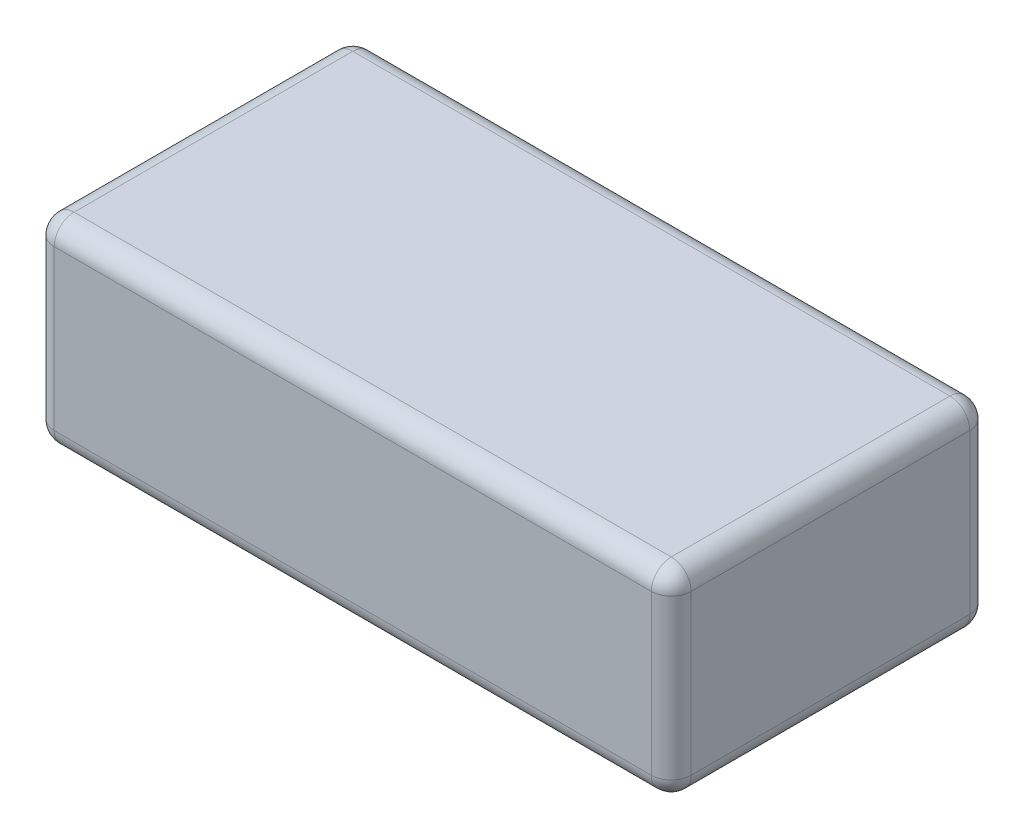
ISO-10303-21;
HEADER;
FILE_DESCRIPTION(('STEP AP214'),'2;1');
FILE_NAME('part.step','',(''),(''),'','','');
FILE_SCHEMA(('AUTOMOTIVE_DESIGN { 1 0 10303 214 1 1 1 1 }'));
ENDSEC;
DATA;
#1=APPLICATION_CONTEXT('core data for automotive mechanical design processes');
#2=APPLICATION_PROTOCOL_DEFINITION('international standard','automotive_design',2000,#1);
#3=PRODUCT_CONTEXT('',#1,'mechanical');
#4=PRODUCT('Part','Part','',(#3));
#5=PRODUCT_RELATED_PRODUCT_CATEGORY('part','',(#4));
#6=PRODUCT_DEFINITION_FORMATION('','',#4);
#7=PRODUCT_DEFINITION_CONTEXT('part definition',#1,'design');
#8=PRODUCT_DEFINITION('design','',#6,#7);
#9=PRODUCT_DEFINITION_SHAPE('','',#8);
#10=(LENGTH_UNIT() NAMED_UNIT(*) SI_UNIT(.MILLI.,.METRE.));
#11=(NAMED_UNIT(*) PLANE_ANGLE_UNIT() SI_UNIT($,.RADIAN.));
#12=(NAMED_UNIT(*) SI_UNIT($,.STERADIAN.) SOLID_ANGLE_UNIT());
#13=UNCERTAINTY_MEASURE_WITH_UNIT(LENGTH_MEASURE(1.E-05),#10,'distance_accuracy_value','');
#14=(GEOMETRIC_REPRESENTATION_CONTEXT(3) GLOBAL_UNCERTAINTY_ASSIGNED_CONTEXT((#13)) GLOBAL_UNIT_ASSIGNED_CONTEXT((#10,
#11,#12)) REPRESENTATION_CONTEXT('',''));
#15=CARTESIAN_POINT('',(0.,0.,0.));
#16=DIRECTION('',(0.,0.,1.));
#17=DIRECTION('',(1.,0.,0.));
#18=AXIS2_PLACEMENT_3D('',#15,#16,#17);
#19=CARTESIAN_POINT('',(0.75,0.05,0.35));
#20=DIRECTION('',(1.,0.,0.));
#21=DIRECTION('',(0.,0.,-1.));
#22=AXIS2_PLACEMENT_3D('',#19,#20,#21);
#23=SPHERICAL_SURFACE('',#22,0.05);
#24=CARTESIAN_POINT('',(0.75,0.05,0.35));
#25=DIRECTION('',(-1.,0.,0.));
#26=DIRECTION('',(0.,0.,1.));
#27=AXIS2_PLACEMENT_3D('',#24,#25,#26);
#28=CIRCLE('',#27,0.05);
#29=CARTESIAN_POINT('',(0.75,0.,0.35));
#30=VERTEX_POINT('',#29);
#31=CARTESIAN_POINT('',(0.75,0.050000000000024,0.4));
#32=VERTEX_POINT('',#31);
#33=EDGE_CURVE('E111',#30,#32,#28,.T.);
#34=ORIENTED_EDGE('',*,*,#33,.F.);
#35=CARTESIAN_POINT('',(0.75,0.05,0.35));
#36=DIRECTION('',(0.,0.,1.));
#37=DIRECTION('',(1.,0.,0.));
#38=AXIS2_PLACEMENT_3D('',#35,#36,#37);
#39=CIRCLE('',#38,0.05);
#40=CARTESIAN_POINT('',(0.8,0.05,0.35));
#41=VERTEX_POINT('',#40);
#42=EDGE_CURVE('E122',#41,#30,#39,.F.);
#43=ORIENTED_EDGE('',*,*,#42,.F.);
#44=CARTESIAN_POINT('',(0.75,0.05,0.35));
#45=DIRECTION('',(0.,-1.,0.));
#46=DIRECTION('',(0.,0.,-1.));
#47=AXIS2_PLACEMENT_3D('',#44,#45,#46);
#48=CIRCLE('',#47,0.05);
#49=EDGE_CURVE('E131',#32,#41,#48,.F.);
#50=ORIENTED_EDGE('',*,*,#49,.F.);
#51=EDGE_LOOP('',(#34,#43,#50));
#52=FACE_BOUND('',#51,.T.);
#53=ADVANCED_FACE('F17',(#52),#23,.T.);
#54=CARTESIAN_POINT('',(-0.75,0.05,0.35));
#55=DIRECTION('',(1.,0.,0.));
#56=DIRECTION('',(0.,0.,-1.));
#57=AXIS2_PLACEMENT_3D('',#54,#55,#56);
#58=SPHERICAL_SURFACE('',#57,0.05);
#59=CARTESIAN_POINT('',(-0.75,0.05,0.35));
#60=DIRECTION('',(0.,-1.,0.));
#61=DIRECTION('',(0.,0.,-1.));
#62=AXIS2_PLACEMENT_3D('',#59,#60,#61);
#63=CIRCLE('',#62,0.05);
#64=CARTESIAN_POINT('',(-0.8,0.05,0.35));
#65=VERTEX_POINT('',#64);
#66=CARTESIAN_POINT('',(-0.75,0.05,0.4));
#67=VERTEX_POINT('',#66);
#68=EDGE_CURVE('E261',#65,#67,#63,.F.);
#69=ORIENTED_EDGE('',*,*,#68,.F.);
#70=CARTESIAN_POINT('',(-0.75,0.05,0.35));
#71=DIRECTION('',(0.,0.,-1.));
#72=DIRECTION('',(-1.,0.,0.));
#73=AXIS2_PLACEMENT_3D('',#70,#71,#72);
#74=CIRCLE('',#73,0.05);
#75=CARTESIAN_POINT('',(-0.75,0.,0.35));
#76=VERTEX_POINT('',#75);
#77=EDGE_CURVE('E270',#76,#65,#74,.T.);
#78=ORIENTED_EDGE('',*,*,#77,.F.);
#79=CARTESIAN_POINT('',(-0.75,0.05,0.35));
#80=DIRECTION('',(-1.,0.,0.));
#81=DIRECTION('',(0.,0.,1.));
#82=AXIS2_PLACEMENT_3D('',#79,#80,#81);
#83=CIRCLE('',#82,0.05);
#84=EDGE_CURVE('E114',#67,#76,#83,.F.);
#85=ORIENTED_EDGE('',*,*,#84,.F.);
#86=EDGE_LOOP('',(#69,#78,#85));
#87=FACE_BOUND('',#86,.T.);
#88=ADVANCED_FACE('F151',(#87),#58,.T.);
#89=CARTESIAN_POINT('',(-0.75,0.05,-0.35));
#90=DIRECTION('',(1.,0.,0.));
#91=DIRECTION('',(0.,0.,-1.));
#92=AXIS2_PLACEMENT_3D('',#89,#90,#91);
#93=SPHERICAL_SURFACE('',#92,0.05);
#94=CARTESIAN_POINT('',(-0.75,0.05,-0.35));
#95=DIRECTION('',(0.,-1.,0.));
#96=DIRECTION('',(0.,0.,-1.));
#97=AXIS2_PLACEMENT_3D('',#94,#95,#96);
#98=CIRCLE('',#97,0.05);
#99=CARTESIAN_POINT('',(-0.75,0.05,-0.4));
#100=VERTEX_POINT('',#99);
#101=CARTESIAN_POINT('',(-0.8,0.05,-0.35));
#102=VERTEX_POINT('',#101);
#103=EDGE_CURVE('E256',#100,#102,#98,.F.);
#104=ORIENTED_EDGE('',*,*,#103,.F.);
#105=CARTESIAN_POINT('',(-0.75,0.05,-0.35));
#106=DIRECTION('',(1.,0.,0.));
#107=DIRECTION('',(0.,0.,-1.));
#108=AXIS2_PLACEMENT_3D('',#105,#106,#107);
#109=CIRCLE('',#108,0.05);
#110=CARTESIAN_POINT('',(-0.75,0.,-0.35));
#111=VERTEX_POINT('',#110);
#112=EDGE_CURVE('E253',#111,#100,#109,.T.);
#113=ORIENTED_EDGE('',*,*,#112,.F.);
#114=CARTESIAN_POINT('',(-0.75,0.05,-0.35));
#115=DIRECTION('',(0.,0.,-1.));
#116=DIRECTION('',(-1.,0.,0.));
#117=AXIS2_PLACEMENT_3D('',#114,#115,#116);
#118=CIRCLE('',#117,0.05);
#119=EDGE_CURVE('E267',#102,#111,#118,.F.);
#120=ORIENTED_EDGE('',*,*,#119,.F.);
#121=EDGE_LOOP('',(#104,#113,#120));
#122=FACE_BOUND('',#121,.T.);
#123=ADVANCED_FACE('F147',(#122),#93,.T.);
#124=CARTESIAN_POINT('',(0.75,0.05,-0.35));
#125=DIRECTION('',(1.,0.,0.));
#126=DIRECTION('',(0.,0.,-1.));
#127=AXIS2_PLACEMENT_3D('',#124,#125,#126);
#128=SPHERICAL_SURFACE('',#127,0.05);
#129=CARTESIAN_POINT('',(0.75,0.05,-0.35));
#130=DIRECTION('',(1.,0.,0.));
#131=DIRECTION('',(0.,0.,-1.));
#132=AXIS2_PLACEMENT_3D('',#129,#130,#131);
#133=CIRCLE('',#132,0.05);
#134=CARTESIAN_POINT('',(0.75,0.05,-0.4));
#135=VERTEX_POINT('',#134);
#136=CARTESIAN_POINT('',(0.75,0.,-0.35));
#137=VERTEX_POINT('',#136);
#138=EDGE_CURVE('E251',#135,#137,#133,.F.);
#139=ORIENTED_EDGE('',*,*,#138,.F.);
#140=CARTESIAN_POINT('',(0.75,0.05,-0.35));
#141=DIRECTION('',(0.,-1.,0.));
#142=DIRECTION('',(0.,0.,-1.));
#143=AXIS2_PLACEMENT_3D('',#140,#141,#142);
#144=CIRCLE('',#143,0.05);
#145=CARTESIAN_POINT('',(0.8,0.05,-0.35));
#146=VERTEX_POINT('',#145);
#147=EDGE_CURVE('E258',#146,#135,#144,.F.);
#148=ORIENTED_EDGE('',*,*,#147,.F.);
#149=CARTESIAN_POINT('',(0.75,0.05,-0.35));
#150=DIRECTION('',(0.,0.,1.));
#151=DIRECTION('',(1.,0.,0.));
#152=AXIS2_PLACEMENT_3D('',#149,#150,#151);
#153=CIRCLE('',#152,0.05);
#154=EDGE_CURVE('E133',#137,#146,#153,.T.);
#155=ORIENTED_EDGE('',*,*,#154,.F.);
#156=EDGE_LOOP('',(#139,#148,#155));
#157=FACE_BOUND('',#156,.T.);
#158=ADVANCED_FACE('F143',(#157),#128,.T.);
#159=CARTESIAN_POINT('',(0.75,0.05,0.4));
#160=DIRECTION('',(0.,0.,1.));
#161=DIRECTION('',(1.,0.,0.));
#162=AXIS2_PLACEMENT_3D('',#159,#160,#161);
#163=CYLINDRICAL_SURFACE('',#162,0.05);
#164=ORIENTED_EDGE('',*,*,#154,.T.);
#165=DIRECTION('',(0.,0.,1.));
#166=VECTOR('',#165,1.);
#167=CARTESIAN_POINT('',(0.8,0.05,0.4));
#168=LINE('',#167,#166);
#169=EDGE_CURVE('E127',#146,#41,#168,.T.);
#170=ORIENTED_EDGE('',*,*,#169,.T.);
#171=ORIENTED_EDGE('',*,*,#42,.T.);
#172=DIRECTION('',(0.,0.,1.));
#173=VECTOR('',#172,1.);
#174=CARTESIAN_POINT('',(0.75,0.,0.4));
#175=LINE('',#174,#173);
#176=EDGE_CURVE('E124',#30,#137,#175,.F.);
#177=ORIENTED_EDGE('',*,*,#176,.T.);
#178=EDGE_LOOP('',(#164,#170,#171,#177));
#179=FACE_BOUND('',#178,.T.);
#180=ADVANCED_FACE('F123',(#179),#163,.T.);
#181=CARTESIAN_POINT('',(0.75,0.5,0.35));
#182=DIRECTION('',(0.,-1.,0.));
#183=DIRECTION('',(0.,0.,-1.));
#184=AXIS2_PLACEMENT_3D('',#181,#182,#183);
#185=CYLINDRICAL_SURFACE('',#184,0.05);
#186=ORIENTED_EDGE('',*,*,#49,.T.);
#187=DIRECTION('',(0.,1.,0.));
#188=VECTOR('',#187,1.);
#189=CARTESIAN_POINT('',(0.8,0.5,0.35));
#190=LINE('',#189,#188);
#191=CARTESIAN_POINT('',(0.8,0.45,0.35));
#192=VERTEX_POINT('',#191);
#193=EDGE_CURVE('E247',#41,#192,#190,.T.);
#194=ORIENTED_EDGE('',*,*,#193,.T.);
#195=CARTESIAN_POINT('',(0.75,0.45,0.35));
#196=DIRECTION('',(0.,-1.,0.));
#197=DIRECTION('',(1.,0.,0.));
#198=AXIS2_PLACEMENT_3D('',#195,#196,#197);
#199=CIRCLE('',#198,0.05);
#200=CARTESIAN_POINT('',(0.75,0.45,0.4));
#201=VERTEX_POINT('',#200);
#202=EDGE_CURVE('E242',#201,#192,#199,.F.);
#203=ORIENTED_EDGE('',*,*,#202,.F.);
#204=DIRECTION('',(0.,1.,0.));
#205=VECTOR('',#204,1.);
#206=CARTESIAN_POINT('',(0.75,0.5,0.4));
#207=LINE('',#206,#205);
#208=EDGE_CURVE('E116',#201,#32,#207,.F.);
#209=ORIENTED_EDGE('',*,*,#208,.T.);
#210=EDGE_LOOP('',(#186,#194,#203,#209));
#211=FACE_BOUND('',#210,.T.);
#212=ADVANCED_FACE('F274',(#211),#185,.T.);
#213=CARTESIAN_POINT('',(-0.75,0.05,0.4));
#214=DIRECTION('',(0.,0.,-1.));
#215=DIRECTION('',(-1.,0.,0.));
#216=AXIS2_PLACEMENT_3D('',#213,#214,#215);
#217=CYLINDRICAL_SURFACE('',#216,0.05);
#218=ORIENTED_EDGE('',*,*,#119,.T.);
#219=DIRECTION('',(0.,0.,-1.));
#220=VECTOR('',#219,1.);
#221=CARTESIAN_POINT('',(-0.75,0.,0.4));
#222=LINE('',#221,#220);
#223=EDGE_CURVE('E264',#111,#76,#222,.F.);
#224=ORIENTED_EDGE('',*,*,#223,.T.);
#225=ORIENTED_EDGE('',*,*,#77,.T.);
#226=DIRECTION('',(0.,0.,-1.));
#227=VECTOR('',#226,1.);
#228=CARTESIAN_POINT('',(-0.8,0.05,0.4));
#229=LINE('',#228,#227);
#230=EDGE_CURVE('E220',#65,#102,#229,.T.);
#231=ORIENTED_EDGE('',*,*,#230,.T.);
#232=EDGE_LOOP('',(#218,#224,#225,#231));
#233=FACE_BOUND('',#232,.T.);
#234=ADVANCED_FACE('F361',(#233),#217,.T.);
#235=CARTESIAN_POINT('',(-0.75,0.5,0.35));
#236=DIRECTION('',(0.,-1.,0.));
#237=DIRECTION('',(0.,0.,-1.));
#238=AXIS2_PLACEMENT_3D('',#235,#236,#237);
#239=CYLINDRICAL_SURFACE('',#238,0.05);
#240=ORIENTED_EDGE('',*,*,#68,.T.);
#241=DIRECTION('',(0.,1.,0.));
#242=VECTOR('',#241,1.);
#243=CARTESIAN_POINT('',(-0.75,0.5,0.4));
#244=LINE('',#243,#242);
#245=CARTESIAN_POINT('',(-0.75,0.45,0.4));
#246=VERTEX_POINT('',#245);
#247=EDGE_CURVE('E241',#67,#246,#244,.T.);
#248=ORIENTED_EDGE('',*,*,#247,.T.);
#249=CARTESIAN_POINT('',(-0.75,0.45,0.35));
#250=DIRECTION('',(0.,-1.,0.));
#251=DIRECTION('',(1.,0.,0.));
#252=AXIS2_PLACEMENT_3D('',#249,#250,#251);
#253=CIRCLE('',#252,0.05);
#254=CARTESIAN_POINT('',(-0.8,0.45,0.35));
#255=VERTEX_POINT('',#254);
#256=EDGE_CURVE('E223',#255,#246,#253,.F.);
#257=ORIENTED_EDGE('',*,*,#256,.F.);
#258=DIRECTION('',(0.,1.,0.));
#259=VECTOR('',#258,1.);
#260=CARTESIAN_POINT('',(-0.8,0.5,0.35));
#261=LINE('',#260,#259);
#262=EDGE_CURVE('E214',#255,#65,#261,.F.);
#263=ORIENTED_EDGE('',*,*,#262,.T.);
#264=EDGE_LOOP('',(#240,#248,#257,#263));
#265=FACE_BOUND('',#264,.T.);
#266=ADVANCED_FACE('F359',(#265),#239,.T.);
#267=CARTESIAN_POINT('',(0.75,0.5,-0.35));
#268=DIRECTION('',(0.,-1.,0.));
#269=DIRECTION('',(0.,0.,-1.));
#270=AXIS2_PLACEMENT_3D('',#267,#268,#269);
#271=CYLINDRICAL_SURFACE('',#270,0.05);
#272=ORIENTED_EDGE('',*,*,#147,.T.);
#273=DIRECTION('',(0.,1.,0.));
#274=VECTOR('',#273,1.);
#275=CARTESIAN_POINT('',(0.75,0.5,-0.4));
#276=LINE('',#275,#274);
#277=CARTESIAN_POINT('',(0.75,0.45,-0.4));
#278=VERTEX_POINT('',#277);
#279=EDGE_CURVE('E206',#135,#278,#276,.T.);
#280=ORIENTED_EDGE('',*,*,#279,.T.);
#281=CARTESIAN_POINT('',(0.75,0.45,-0.35));
#282=DIRECTION('',(0.,1.,0.));
#283=DIRECTION('',(1.,0.,0.));
#284=AXIS2_PLACEMENT_3D('',#281,#282,#283);
#285=CIRCLE('',#284,0.05);
#286=CARTESIAN_POINT('',(0.8,0.45,-0.35));
#287=VERTEX_POINT('',#286);
#288=EDGE_CURVE('E208',#287,#278,#285,.T.);
#289=ORIENTED_EDGE('',*,*,#288,.F.);
#290=DIRECTION('',(0.,1.,0.));
#291=VECTOR('',#290,1.);
#292=CARTESIAN_POINT('',(0.8,0.5,-0.35));
#293=LINE('',#292,#291);
#294=EDGE_CURVE('E117',#287,#146,#293,.F.);
#295=ORIENTED_EDGE('',*,*,#294,.T.);
#296=EDGE_LOOP('',(#272,#280,#289,#295));
#297=FACE_BOUND('',#296,.T.);
#298=ADVANCED_FACE('F310',(#297),#271,.T.);
#299=CARTESIAN_POINT('',(-0.75,0.5,-0.35));
#300=DIRECTION('',(0.,-1.,0.));
#301=DIRECTION('',(0.,0.,-1.));
#302=AXIS2_PLACEMENT_3D('',#299,#300,#301);
#303=CYLINDRICAL_SURFACE('',#302,0.05);
#304=CARTESIAN_POINT('',(-0.75,0.45,-0.35));
#305=DIRECTION('',(0.,1.,0.));
#306=DIRECTION('',(1.,0.,0.));
#307=AXIS2_PLACEMENT_3D('',#304,#305,#306);
#308=CIRCLE('',#307,0.05);
#309=CARTESIAN_POINT('',(-0.75,0.45,-0.4));
#310=VERTEX_POINT('',#309);
#311=CARTESIAN_POINT('',(-0.8,0.45,-0.35));
#312=VERTEX_POINT('',#311);
#313=EDGE_CURVE('E210',#310,#312,#308,.T.);
#314=ORIENTED_EDGE('',*,*,#313,.F.);
#315=DIRECTION('',(0.,1.,0.));
#316=VECTOR('',#315,1.);
#317=CARTESIAN_POINT('',(-0.75,0.5,-0.4));
#318=LINE('',#317,#316);
#319=EDGE_CURVE('E300',#310,#100,#318,.F.);
#320=ORIENTED_EDGE('',*,*,#319,.T.);
#321=ORIENTED_EDGE('',*,*,#103,.T.);
#322=DIRECTION('',(0.,1.,0.));
#323=VECTOR('',#322,1.);
#324=CARTESIAN_POINT('',(-0.8,0.5,-0.35));
#325=LINE('',#324,#323);
#326=EDGE_CURVE('E217',#102,#312,#325,.T.);
#327=ORIENTED_EDGE('',*,*,#326,.T.);
#328=EDGE_LOOP('',(#314,#320,#321,#327));
#329=FACE_BOUND('',#328,.T.);
#330=ADVANCED_FACE('F351',(#329),#303,.T.);
#331=CARTESIAN_POINT('',(0.8,0.,-0.4));
#332=DIRECTION('',(0.,-1.,0.));
#333=DIRECTION('',(0.,0.,-1.));
#334=AXIS2_PLACEMENT_3D('',#331,#332,#333);
#335=PLANE('',#334);
#336=DIRECTION('',(1.,0.,0.));
#337=VECTOR('',#336,1.);
#338=CARTESIAN_POINT('',(-0.8,0.,-0.35));
#339=LINE('',#338,#337);
#340=EDGE_CURVE('E101',#137,#111,#339,.F.);
#341=ORIENTED_EDGE('',*,*,#340,.F.);
#342=ORIENTED_EDGE('',*,*,#176,.F.);
#343=DIRECTION('',(-1.,0.,0.));
#344=VECTOR('',#343,1.);
#345=CARTESIAN_POINT('',(-0.8,0.,0.35));
#346=LINE('',#345,#344);
#347=EDGE_CURVE('E107',#76,#30,#346,.F.);
#348=ORIENTED_EDGE('',*,*,#347,.F.);
#349=ORIENTED_EDGE('',*,*,#223,.F.);
#350=EDGE_LOOP('',(#341,#342,#348,#349));
#351=FACE_BOUND('',#350,.T.);
#352=ADVANCED_FACE('F135',(#351),#335,.T.);
#353=CARTESIAN_POINT('',(0.8,0.5,0.4));
#354=DIRECTION('',(-1.,0.,0.));
#355=DIRECTION('',(0.,0.,1.));
#356=AXIS2_PLACEMENT_3D('',#353,#354,#355);
#357=PLANE('',#356);
#358=DIRECTION('',(0.,0.,-1.));
#359=VECTOR('',#358,1.);
#360=CARTESIAN_POINT('',(0.8,0.45,-0.4));
#361=LINE('',#360,#359);
#362=EDGE_CURVE('E291',#192,#287,#361,.T.);
#363=ORIENTED_EDGE('',*,*,#362,.F.);
#364=ORIENTED_EDGE('',*,*,#193,.F.);
#365=ORIENTED_EDGE('',*,*,#169,.F.);
#366=ORIENTED_EDGE('',*,*,#294,.F.);
#367=EDGE_LOOP('',(#363,#364,#365,#366));
#368=FACE_BOUND('',#367,.T.);
#369=ADVANCED_FACE('F346',(#368),#357,.F.);
#370=CARTESIAN_POINT('',(-0.8,0.05,0.35));
#371=DIRECTION('',(-1.,0.,0.));
#372=DIRECTION('',(0.,0.,1.));
#373=AXIS2_PLACEMENT_3D('',#370,#371,#372);
#374=CYLINDRICAL_SURFACE('',#373,0.05);
#375=ORIENTED_EDGE('',*,*,#347,.T.);
#376=ORIENTED_EDGE('',*,*,#33,.T.);
#377=DIRECTION('',(-1.,0.,0.));
#378=VECTOR('',#377,1.);
#379=CARTESIAN_POINT('',(-0.8,0.05,0.4));
#380=LINE('',#379,#378);
#381=EDGE_CURVE('E282',#32,#67,#380,.T.);
#382=ORIENTED_EDGE('',*,*,#381,.T.);
#383=ORIENTED_EDGE('',*,*,#84,.T.);
#384=EDGE_LOOP('',(#375,#376,#382,#383));
#385=FACE_BOUND('',#384,.T.);
#386=ADVANCED_FACE('F109',(#385),#374,.T.);
#387=CARTESIAN_POINT('',(0.75,0.45,0.35));
#388=DIRECTION('',(1.,0.,0.));
#389=DIRECTION('',(0.,0.,-1.));
#390=AXIS2_PLACEMENT_3D('',#387,#388,#389);
#391=SPHERICAL_SURFACE('',#390,0.05);
#392=ORIENTED_EDGE('',*,*,#202,.T.);
#393=CARTESIAN_POINT('',(0.75,0.45,0.35));
#394=DIRECTION('',(0.,0.,-1.));
#395=DIRECTION('',(-1.,0.,0.));
#396=AXIS2_PLACEMENT_3D('',#393,#394,#395);
#397=CIRCLE('',#396,0.05);
#398=CARTESIAN_POINT('',(0.75,0.5,0.35));
#399=VERTEX_POINT('',#398);
#400=EDGE_CURVE('E297',#399,#192,#397,.T.);
#401=ORIENTED_EDGE('',*,*,#400,.F.);
#402=CARTESIAN_POINT('',(0.75,0.45,0.35));
#403=DIRECTION('',(1.,0.,0.));
#404=DIRECTION('',(0.,0.,-1.));
#405=AXIS2_PLACEMENT_3D('',#402,#403,#404);
#406=CIRCLE('',#405,0.05);
#407=EDGE_CURVE('E284',#201,#399,#406,.F.);
#408=ORIENTED_EDGE('',*,*,#407,.F.);
#409=EDGE_LOOP('',(#392,#401,#408));
#410=FACE_BOUND('',#409,.T.);
#411=ADVANCED_FACE('F232',(#410),#391,.T.);
#412=CARTESIAN_POINT('',(-0.75,0.45,0.35));
#413=DIRECTION('',(1.,0.,0.));
#414=DIRECTION('',(0.,0.,-1.));
#415=AXIS2_PLACEMENT_3D('',#412,#413,#414);
#416=SPHERICAL_SURFACE('',#415,0.05);
#417=ORIENTED_EDGE('',*,*,#256,.T.);
#418=CARTESIAN_POINT('',(-0.75,0.45,0.35));
#419=DIRECTION('',(1.,0.,0.));
#420=DIRECTION('',(0.,0.,-1.));
#421=AXIS2_PLACEMENT_3D('',#418,#419,#420);
#422=CIRCLE('',#421,0.05);
#423=CARTESIAN_POINT('',(-0.75,0.5,0.35));
#424=VERTEX_POINT('',#423);
#425=EDGE_CURVE('E288',#424,#246,#422,.T.);
#426=ORIENTED_EDGE('',*,*,#425,.F.);
#427=CARTESIAN_POINT('',(-0.75,0.45,0.35));
#428=DIRECTION('',(0.,0.,1.));
#429=DIRECTION('',(1.,0.,0.));
#430=AXIS2_PLACEMENT_3D('',#427,#428,#429);
#431=CIRCLE('',#430,0.05);
#432=EDGE_CURVE('E331',#255,#424,#431,.F.);
#433=ORIENTED_EDGE('',*,*,#432,.F.);
#434=EDGE_LOOP('',(#417,#426,#433));
#435=FACE_BOUND('',#434,.T.);
#436=ADVANCED_FACE('F228',(#435),#416,.T.);
#437=CARTESIAN_POINT('',(-0.8,0.5,0.4));
#438=DIRECTION('',(1.,0.,0.));
#439=DIRECTION('',(0.,0.,-1.));
#440=AXIS2_PLACEMENT_3D('',#437,#438,#439);
#441=PLANE('',#440);
#442=DIRECTION('',(0.,0.,1.));
#443=VECTOR('',#442,1.);
#444=CARTESIAN_POINT('',(-0.8,0.45,-0.4));
#445=LINE('',#444,#443);
#446=EDGE_CURVE('E322',#312,#255,#445,.T.);
#447=ORIENTED_EDGE('',*,*,#446,.F.);
#448=ORIENTED_EDGE('',*,*,#326,.F.);
#449=ORIENTED_EDGE('',*,*,#230,.F.);
#450=ORIENTED_EDGE('',*,*,#262,.F.);
#451=EDGE_LOOP('',(#447,#448,#449,#450));
#452=FACE_BOUND('',#451,.T.);
#453=ADVANCED_FACE('F231',(#452),#441,.F.);
#454=CARTESIAN_POINT('',(-0.75,0.45,-0.35));
#455=DIRECTION('',(1.,0.,0.));
#456=DIRECTION('',(0.,0.,-1.));
#457=AXIS2_PLACEMENT_3D('',#454,#455,#456);
#458=SPHERICAL_SURFACE('',#457,0.05);
#459=CARTESIAN_POINT('',(-0.75,0.45,-0.35));
#460=DIRECTION('',(0.,0.,1.));
#461=DIRECTION('',(1.,0.,0.));
#462=AXIS2_PLACEMENT_3D('',#459,#460,#461);
#463=CIRCLE('',#462,0.05);
#464=CARTESIAN_POINT('',(-0.75,0.5,-0.350000000000096));
#465=VERTEX_POINT('',#464);
#466=EDGE_CURVE('E328',#465,#312,#463,.T.);
#467=ORIENTED_EDGE('',*,*,#466,.F.);
#468=CARTESIAN_POINT('',(-0.75,0.45,-0.35));
#469=DIRECTION('',(-1.,0.,0.));
#470=DIRECTION('',(0.,0.,1.));
#471=AXIS2_PLACEMENT_3D('',#468,#469,#470);
#472=CIRCLE('',#471,0.05);
#473=EDGE_CURVE('E318',#310,#465,#472,.F.);
#474=ORIENTED_EDGE('',*,*,#473,.F.);
#475=ORIENTED_EDGE('',*,*,#313,.T.);
#476=EDGE_LOOP('',(#467,#474,#475));
#477=FACE_BOUND('',#476,.T.);
#478=ADVANCED_FACE('F199',(#477),#458,.T.);
#479=CARTESIAN_POINT('',(0.75,0.45,-0.35));
#480=DIRECTION('',(1.,0.,0.));
#481=DIRECTION('',(0.,0.,-1.));
#482=AXIS2_PLACEMENT_3D('',#479,#480,#481);
#483=SPHERICAL_SURFACE('',#482,0.05);
#484=CARTESIAN_POINT('',(0.75,0.45,-0.35));
#485=DIRECTION('',(0.,0.,-1.));
#486=DIRECTION('',(-1.,0.,0.));
#487=AXIS2_PLACEMENT_3D('',#484,#485,#486);
#488=CIRCLE('',#487,0.05);
#489=CARTESIAN_POINT('',(0.75,0.5,-0.35));
#490=VERTEX_POINT('',#489);
#491=EDGE_CURVE('E285',#287,#490,#488,.F.);
#492=ORIENTED_EDGE('',*,*,#491,.F.);
#493=ORIENTED_EDGE('',*,*,#288,.T.);
#494=CARTESIAN_POINT('',(0.75,0.45,-0.35));
#495=DIRECTION('',(-1.,0.,0.));
#496=DIRECTION('',(0.,0.,1.));
#497=AXIS2_PLACEMENT_3D('',#494,#495,#496);
#498=CIRCLE('',#497,0.05);
#499=EDGE_CURVE('E315',#490,#278,#498,.T.);
#500=ORIENTED_EDGE('',*,*,#499,.F.);
#501=EDGE_LOOP('',(#492,#493,#500));
#502=FACE_BOUND('',#501,.T.);
#503=ADVANCED_FACE('F194',(#502),#483,.T.);
#504=CARTESIAN_POINT('',(-0.8,0.05,-0.35));
#505=DIRECTION('',(1.,0.,0.));
#506=DIRECTION('',(0.,0.,-1.));
#507=AXIS2_PLACEMENT_3D('',#504,#505,#506);
#508=CYLINDRICAL_SURFACE('',#507,0.05);
#509=DIRECTION('',(1.,0.,0.));
#510=VECTOR('',#509,1.);
#511=CARTESIAN_POINT('',(-0.8,0.05,-0.4));
#512=LINE('',#511,#510);
#513=EDGE_CURVE('E317',#100,#135,#512,.T.);
#514=ORIENTED_EDGE('',*,*,#513,.T.);
#515=ORIENTED_EDGE('',*,*,#138,.T.);
#516=ORIENTED_EDGE('',*,*,#340,.T.);
#517=ORIENTED_EDGE('',*,*,#112,.T.);
#518=EDGE_LOOP('',(#514,#515,#516,#517));
#519=FACE_BOUND('',#518,.T.);
#520=ADVANCED_FACE('F190',(#519),#508,.T.);
#521=CARTESIAN_POINT('',(0.75,0.45,-0.4));
#522=DIRECTION('',(0.,0.,-1.));
#523=DIRECTION('',(-1.,0.,0.));
#524=AXIS2_PLACEMENT_3D('',#521,#522,#523);
#525=CYLINDRICAL_SURFACE('',#524,0.05);
#526=ORIENTED_EDGE('',*,*,#491,.T.);
#527=DIRECTION('',(0.,0.,-1.));
#528=VECTOR('',#527,1.);
#529=CARTESIAN_POINT('',(0.75,0.5,-0.4));
#530=LINE('',#529,#528);
#531=EDGE_CURVE('E320',#490,#399,#530,.F.);
#532=ORIENTED_EDGE('',*,*,#531,.T.);
#533=ORIENTED_EDGE('',*,*,#400,.T.);
#534=ORIENTED_EDGE('',*,*,#362,.T.);
#535=EDGE_LOOP('',(#526,#532,#533,#534));
#536=FACE_BOUND('',#535,.T.);
#537=ADVANCED_FACE('F186',(#536),#525,.T.);
#538=CARTESIAN_POINT('',(-0.8,0.5,0.4));
#539=DIRECTION('',(0.,0.,-1.));
#540=DIRECTION('',(-1.,0.,0.));
#541=AXIS2_PLACEMENT_3D('',#538,#539,#540);
#542=PLANE('',#541);
#543=DIRECTION('',(1.,0.,0.));
#544=VECTOR('',#543,1.);
#545=CARTESIAN_POINT('',(0.8,0.45,0.4));
#546=LINE('',#545,#544);
#547=EDGE_CURVE('E280',#246,#201,#546,.T.);
#548=ORIENTED_EDGE('',*,*,#547,.F.);
#549=ORIENTED_EDGE('',*,*,#247,.F.);
#550=ORIENTED_EDGE('',*,*,#381,.F.);
#551=ORIENTED_EDGE('',*,*,#208,.F.);
#552=EDGE_LOOP('',(#548,#549,#550,#551));
#553=FACE_BOUND('',#552,.T.);
#554=ADVANCED_FACE('F182',(#553),#542,.F.);
#555=CARTESIAN_POINT('',(-0.75,0.45,-0.4));
#556=DIRECTION('',(0.,0.,1.));
#557=DIRECTION('',(1.,0.,0.));
#558=AXIS2_PLACEMENT_3D('',#555,#556,#557);
#559=CYLINDRICAL_SURFACE('',#558,0.05);
#560=ORIENTED_EDGE('',*,*,#466,.T.);
#561=ORIENTED_EDGE('',*,*,#446,.T.);
#562=ORIENTED_EDGE('',*,*,#432,.T.);
#563=DIRECTION('',(0.,0.,-1.));
#564=VECTOR('',#563,1.);
#565=CARTESIAN_POINT('',(-0.75,0.5,-0.4));
#566=LINE('',#565,#564);
#567=EDGE_CURVE('E338',#424,#465,#566,.T.);
#568=ORIENTED_EDGE('',*,*,#567,.T.);
#569=EDGE_LOOP('',(#560,#561,#562,#568));
#570=FACE_BOUND('',#569,.T.);
#571=ADVANCED_FACE('F178',(#570),#559,.T.);
#572=CARTESIAN_POINT('',(-0.8,0.5,-0.4));
#573=DIRECTION('',(0.,0.,1.));
#574=DIRECTION('',(1.,0.,0.));
#575=AXIS2_PLACEMENT_3D('',#572,#573,#574);
#576=PLANE('',#575);
#577=ORIENTED_EDGE('',*,*,#513,.F.);
#578=ORIENTED_EDGE('',*,*,#319,.F.);
#579=DIRECTION('',(-1.,0.,0.));
#580=VECTOR('',#579,1.);
#581=CARTESIAN_POINT('',(0.8,0.45,-0.4));
#582=LINE('',#581,#580);
#583=EDGE_CURVE('E316',#278,#310,#582,.T.);
#584=ORIENTED_EDGE('',*,*,#583,.F.);
#585=ORIENTED_EDGE('',*,*,#279,.F.);
#586=EDGE_LOOP('',(#577,#578,#584,#585));
#587=FACE_BOUND('',#586,.T.);
#588=ADVANCED_FACE('F174',(#587),#576,.F.);
#589=CARTESIAN_POINT('',(0.8,0.45,0.35));
#590=DIRECTION('',(1.,0.,0.));
#591=DIRECTION('',(0.,0.,-1.));
#592=AXIS2_PLACEMENT_3D('',#589,#590,#591);
#593=CYLINDRICAL_SURFACE('',#592,0.05);
#594=ORIENTED_EDGE('',*,*,#547,.T.);
#595=ORIENTED_EDGE('',*,*,#407,.T.);
#596=DIRECTION('',(1.,0.,0.));
#597=VECTOR('',#596,1.);
#598=CARTESIAN_POINT('',(0.8,0.5,0.35));
#599=LINE('',#598,#597);
#600=EDGE_CURVE('E26',#399,#424,#599,.F.);
#601=ORIENTED_EDGE('',*,*,#600,.T.);
#602=ORIENTED_EDGE('',*,*,#425,.T.);
#603=EDGE_LOOP('',(#594,#595,#601,#602));
#604=FACE_BOUND('',#603,.T.);
#605=ADVANCED_FACE('F168',(#604),#593,.T.);
#606=CARTESIAN_POINT('',(0.8,0.45,-0.35));
#607=DIRECTION('',(-1.,0.,0.));
#608=DIRECTION('',(0.,0.,1.));
#609=AXIS2_PLACEMENT_3D('',#606,#607,#608);
#610=CYLINDRICAL_SURFACE('',#609,0.05);
#611=DIRECTION('',(1.,0.,0.));
#612=VECTOR('',#611,1.);
#613=CARTESIAN_POINT('',(0.8,0.5,-0.35));
#614=LINE('',#613,#612);
#615=EDGE_CURVE('E11',#465,#490,#614,.T.);
#616=ORIENTED_EDGE('',*,*,#615,.T.);
#617=ORIENTED_EDGE('',*,*,#499,.T.);
#618=ORIENTED_EDGE('',*,*,#583,.T.);
#619=ORIENTED_EDGE('',*,*,#473,.T.);
#620=EDGE_LOOP('',(#616,#617,#618,#619));
#621=FACE_BOUND('',#620,.T.);
#622=ADVANCED_FACE('F163',(#621),#610,.T.);
#623=CARTESIAN_POINT('',(0.8,0.5,-0.4));
#624=DIRECTION('',(0.,-1.,0.));
#625=DIRECTION('',(0.,0.,-1.));
#626=AXIS2_PLACEMENT_3D('',#623,#624,#625);
#627=PLANE('',#626);
#628=ORIENTED_EDGE('',*,*,#615,.F.);
#629=ORIENTED_EDGE('',*,*,#567,.F.);
#630=ORIENTED_EDGE('',*,*,#600,.F.);
#631=ORIENTED_EDGE('',*,*,#531,.F.);
#632=EDGE_LOOP('',(#628,#629,#630,#631));
#633=FACE_BOUND('',#632,.T.);
#634=ADVANCED_FACE('F161',(#633),#627,.F.);
#635=CLOSED_SHELL('',(#53,#88,#123,#158,#180,#212,#234,#266,#298,#330,#352,#369,#386,#411,#436,
#453,#478,#503,#520,#537,#554,#571,#588,#605,#622,#634));
#636=MANIFOLD_SOLID_BREP('B1',#635);
#637=ADVANCED_BREP_SHAPE_REPRESENTATION('',(#18,#636),#14);
#638=SHAPE_DEFINITION_REPRESENTATION(#9,#637);
ENDSEC;
END-ISO-10303-21;
